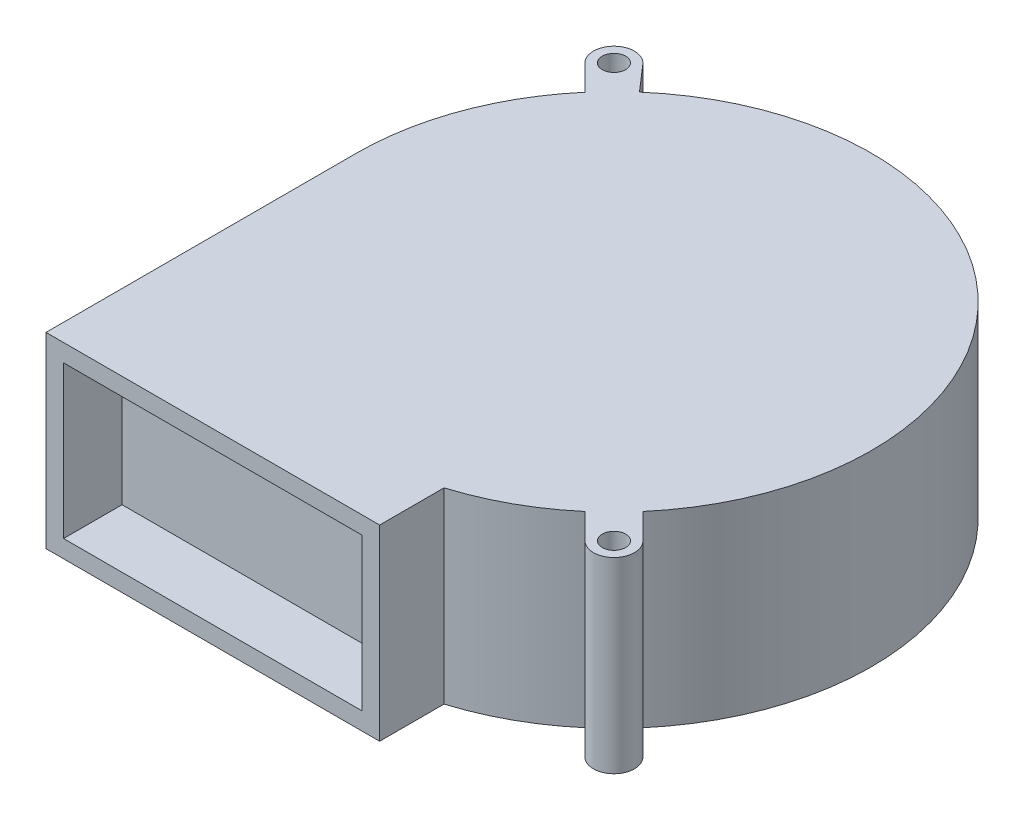
ISO-10303-21;
HEADER;
FILE_DESCRIPTION(('STEP AP214'),'2;1');
FILE_NAME('part.step','',(''),(''),'','','');
FILE_SCHEMA(('AUTOMOTIVE_DESIGN { 1 0 10303 214 1 1 1 1 }'));
ENDSEC;
DATA;
#1=APPLICATION_CONTEXT('core data for automotive mechanical design processes');
#2=APPLICATION_PROTOCOL_DEFINITION('international standard','automotive_design',2000,#1);
#3=PRODUCT_CONTEXT('',#1,'mechanical');
#4=PRODUCT('Part','Part','',(#3));
#5=PRODUCT_RELATED_PRODUCT_CATEGORY('part','',(#4));
#6=PRODUCT_DEFINITION_FORMATION('','',#4);
#7=PRODUCT_DEFINITION_CONTEXT('part definition',#1,'design');
#8=PRODUCT_DEFINITION('design','',#6,#7);
#9=PRODUCT_DEFINITION_SHAPE('','',#8);
#10=(LENGTH_UNIT() NAMED_UNIT(*) SI_UNIT(.MILLI.,.METRE.));
#11=(NAMED_UNIT(*) PLANE_ANGLE_UNIT() SI_UNIT($,.RADIAN.));
#12=(NAMED_UNIT(*) SI_UNIT($,.STERADIAN.) SOLID_ANGLE_UNIT());
#13=UNCERTAINTY_MEASURE_WITH_UNIT(LENGTH_MEASURE(1.E-05),#10,'distance_accuracy_value','');
#14=(GEOMETRIC_REPRESENTATION_CONTEXT(3) GLOBAL_UNCERTAINTY_ASSIGNED_CONTEXT((#13)) GLOBAL_UNIT_ASSIGNED_CONTEXT((#10,
#11,#12)) REPRESENTATION_CONTEXT('',''));
#15=CARTESIAN_POINT('',(0.,0.,0.));
#16=DIRECTION('',(0.,0.,1.));
#17=DIRECTION('',(1.,0.,0.));
#18=AXIS2_PLACEMENT_3D('',#15,#16,#17);
#19=CARTESIAN_POINT('',(35.3553390593273,32.,35.3553390593274));
#20=DIRECTION('',(0.,1.,0.));
#21=DIRECTION('',(0.,0.,1.));
#22=AXIS2_PLACEMENT_3D('',#19,#20,#21);
#23=PLANE('',#22);
#24=CARTESIAN_POINT('',(-35.3553390593273,32.,-35.3553390593274));
#25=DIRECTION('',(0.,1.,0.));
#26=DIRECTION('',(0.,0.,1.));
#27=AXIS2_PLACEMENT_3D('',#24,#25,#26);
#28=CIRCLE('',#27,2.);
#29=CARTESIAN_POINT('',(-35.3553390593273,32.,-33.3553390593274));
#30=VERTEX_POINT('',#29);
#31=EDGE_CURVE('E176',#30,#30,#28,.T.);
#32=ORIENTED_EDGE('',*,*,#31,.F.);
#33=EDGE_LOOP('',(#32));
#34=FACE_BOUND('',#33,.T.);
#35=CARTESIAN_POINT('',(35.3553390593273,32.,35.3553390593274));
#36=DIRECTION('',(0.,1.,0.));
#37=DIRECTION('',(0.,0.,1.));
#38=AXIS2_PLACEMENT_3D('',#35,#36,#37);
#39=CIRCLE('',#38,3.50000000000002);
#40=CARTESIAN_POINT('',(32.8804653251744,32.,37.8302127934804));
#41=VERTEX_POINT('',#40);
#42=CARTESIAN_POINT('',(37.8302127934802,32.,32.8804653251745));
#43=VERTEX_POINT('',#42);
#44=EDGE_CURVE('E196',#41,#43,#39,.T.);
#45=ORIENTED_EDGE('',*,*,#44,.T.);
#46=DIRECTION('',(-0.707106781186548,0.,-0.707106781186547));
#47=VECTOR('',#46,1.);
#48=CARTESIAN_POINT('',(37.8302127934802,32.,32.8804653251745));
#49=LINE('',#48,#47);
#50=CARTESIAN_POINT('',(33.4889834263559,32.,28.5392359580501));
#51=VERTEX_POINT('',#50);
#52=EDGE_CURVE('E116',#43,#51,#49,.T.);
#53=ORIENTED_EDGE('',*,*,#52,.T.);
#54=CARTESIAN_POINT('',(0.,32.,0.));
#55=DIRECTION('',(0.,1.,0.));
#56=DIRECTION('',(0.,0.,1.));
#57=AXIS2_PLACEMENT_3D('',#54,#55,#56);
#58=CIRCLE('',#57,44.);
#59=CARTESIAN_POINT('',(-28.8584897686789,32.,-33.2142675407882));
#60=VERTEX_POINT('',#59);
#61=EDGE_CURVE('E223',#51,#60,#58,.T.);
#62=ORIENTED_EDGE('',*,*,#61,.T.);
#63=DIRECTION('',(-0.655874767469976,0.,-0.754869716836094));
#64=VECTOR('',#63,1.);
#65=CARTESIAN_POINT('',(-32.713295050401,32.,-37.6509007454724));
#66=LINE('',#65,#64);
#67=CARTESIAN_POINT('',(-32.713295050401,32.,-37.6509007454723));
#68=VERTEX_POINT('',#67);
#69=EDGE_CURVE('E242',#60,#68,#66,.T.);
#70=ORIENTED_EDGE('',*,*,#69,.T.);
#71=CARTESIAN_POINT('',(-35.3553390593273,32.,-35.3553390593274));
#72=DIRECTION('',(0.,1.,0.));
#73=DIRECTION('',(0.,0.,1.));
#74=AXIS2_PLACEMENT_3D('',#71,#72,#73);
#75=CIRCLE('',#74,3.50000000000001);
#76=CARTESIAN_POINT('',(-37.8302127934802,32.,-32.8804653251745));
#77=VERTEX_POINT('',#76);
#78=EDGE_CURVE('E239',#68,#77,#75,.T.);
#79=ORIENTED_EDGE('',*,*,#78,.T.);
#80=DIRECTION('',(0.707106781186546,0.,0.707106781186549));
#81=VECTOR('',#80,1.);
#82=CARTESIAN_POINT('',(-37.8302127934802,32.,-32.8804653251745));
#83=LINE('',#82,#81);
#84=CARTESIAN_POINT('',(-33.4889834263559,32.,-28.5392359580501));
#85=VERTEX_POINT('',#84);
#86=EDGE_CURVE('E241',#77,#85,#83,.T.);
#87=ORIENTED_EDGE('',*,*,#86,.T.);
#88=CARTESIAN_POINT('',(0.,32.,0.));
#89=DIRECTION('',(0.,1.,0.));
#90=DIRECTION('',(0.,0.,1.));
#91=AXIS2_PLACEMENT_3D('',#88,#89,#90);
#92=CIRCLE('',#91,44.);
#93=CARTESIAN_POINT('',(-44.,32.,0.));
#94=VERTEX_POINT('',#93);
#95=EDGE_CURVE('E244',#85,#94,#92,.T.);
#96=ORIENTED_EDGE('',*,*,#95,.T.);
#97=DIRECTION('',(0.,0.,1.));
#98=VECTOR('',#97,1.);
#99=CARTESIAN_POINT('',(-44.,32.,0.));
#100=LINE('',#99,#98);
#101=CARTESIAN_POINT('',(-44.,32.,53.0356991139674));
#102=VERTEX_POINT('',#101);
#103=EDGE_CURVE('E250',#94,#102,#100,.T.);
#104=ORIENTED_EDGE('',*,*,#103,.T.);
#105=DIRECTION('',(1.,0.,0.));
#106=VECTOR('',#105,1.);
#107=CARTESIAN_POINT('',(-44.,32.,53.0356991139674));
#108=LINE('',#107,#106);
#109=CARTESIAN_POINT('',(13.,32.,53.0356991139674));
#110=VERTEX_POINT('',#109);
#111=EDGE_CURVE('E151',#102,#110,#108,.T.);
#112=ORIENTED_EDGE('',*,*,#111,.T.);
#113=DIRECTION('',(0.,0.,-1.));
#114=VECTOR('',#113,1.);
#115=CARTESIAN_POINT('',(13.,32.,53.0356991139674));
#116=LINE('',#115,#114);
#117=CARTESIAN_POINT('',(13.,32.,42.0356991139674));
#118=VERTEX_POINT('',#117);
#119=EDGE_CURVE('E144',#110,#118,#116,.T.);
#120=ORIENTED_EDGE('',*,*,#119,.T.);
#121=CARTESIAN_POINT('',(0.,32.,0.));
#122=DIRECTION('',(0.,1.,0.));
#123=DIRECTION('',(0.,0.,1.));
#124=AXIS2_PLACEMENT_3D('',#121,#122,#123);
#125=CIRCLE('',#124,44.);
#126=CARTESIAN_POINT('',(28.53923595805,32.,33.488983426356));
#127=VERTEX_POINT('',#126);
#128=EDGE_CURVE('E148',#118,#127,#125,.T.);
#129=ORIENTED_EDGE('',*,*,#128,.T.);
#130=DIRECTION('',(0.707106781186546,0.,0.707106781186549));
#131=VECTOR('',#130,1.);
#132=CARTESIAN_POINT('',(32.8804653251744,32.,37.8302127934804));
#133=LINE('',#132,#131);
#134=EDGE_CURVE('E63',#127,#41,#133,.T.);
#135=ORIENTED_EDGE('',*,*,#134,.T.);
#136=EDGE_LOOP('',(#45,#53,#62,#70,#79,#87,#96,#104,#112,#120,#129,#135));
#137=FACE_BOUND('',#136,.T.);
#138=CARTESIAN_POINT('',(35.3553390593273,32.,35.3553390593274));
#139=DIRECTION('',(0.,1.,0.));
#140=DIRECTION('',(0.,0.,1.));
#141=AXIS2_PLACEMENT_3D('',#138,#139,#140);
#142=CIRCLE('',#141,2.);
#143=CARTESIAN_POINT('',(35.3553390593273,32.,37.3553390593274));
#144=VERTEX_POINT('',#143);
#145=EDGE_CURVE('E271',#144,#144,#142,.T.);
#146=ORIENTED_EDGE('',*,*,#145,.F.);
#147=EDGE_LOOP('',(#146));
#148=FACE_BOUND('',#147,.T.);
#149=ADVANCED_FACE('F39',(#34,#137,#148),#23,.T.);
#150=CARTESIAN_POINT('',(35.3553390593273,0.,35.3553390593274));
#151=DIRECTION('',(0.,1.,0.));
#152=DIRECTION('',(0.,0.,1.));
#153=AXIS2_PLACEMENT_3D('',#150,#151,#152);
#154=PLANE('',#153);
#155=CARTESIAN_POINT('',(35.3553390593273,0.,35.3553390593274));
#156=DIRECTION('',(0.,1.,0.));
#157=DIRECTION('',(0.,0.,1.));
#158=AXIS2_PLACEMENT_3D('',#155,#156,#157);
#159=CIRCLE('',#158,3.50000000000002);
#160=CARTESIAN_POINT('',(32.8804653251744,0.,37.8302127934804));
#161=VERTEX_POINT('',#160);
#162=CARTESIAN_POINT('',(37.8302127934802,0.,32.8804653251745));
#163=VERTEX_POINT('',#162);
#164=EDGE_CURVE('E172',#161,#163,#159,.T.);
#165=ORIENTED_EDGE('',*,*,#164,.F.);
#166=DIRECTION('',(0.707106781186546,0.,0.707106781186549));
#167=VECTOR('',#166,1.);
#168=CARTESIAN_POINT('',(32.8804653251744,0.,37.8302127934804));
#169=LINE('',#168,#167);
#170=CARTESIAN_POINT('',(28.53923595805,0.,33.488983426356));
#171=VERTEX_POINT('',#170);
#172=EDGE_CURVE('E108',#171,#161,#169,.T.);
#173=ORIENTED_EDGE('',*,*,#172,.F.);
#174=CARTESIAN_POINT('',(0.,0.,0.));
#175=DIRECTION('',(0.,1.,0.));
#176=DIRECTION('',(0.,0.,1.));
#177=AXIS2_PLACEMENT_3D('',#174,#175,#176);
#178=CIRCLE('',#177,44.);
#179=CARTESIAN_POINT('',(13.,0.,42.0356991139674));
#180=VERTEX_POINT('',#179);
#181=EDGE_CURVE('E193',#180,#171,#178,.T.);
#182=ORIENTED_EDGE('',*,*,#181,.F.);
#183=DIRECTION('',(0.,0.,-1.));
#184=VECTOR('',#183,1.);
#185=CARTESIAN_POINT('',(13.,0.,53.0356991139674));
#186=LINE('',#185,#184);
#187=CARTESIAN_POINT('',(13.,0.,53.0356991139674));
#188=VERTEX_POINT('',#187);
#189=EDGE_CURVE('E160',#188,#180,#186,.T.);
#190=ORIENTED_EDGE('',*,*,#189,.F.);
#191=DIRECTION('',(1.,0.,0.));
#192=VECTOR('',#191,1.);
#193=CARTESIAN_POINT('',(-44.,0.,53.0356991139674));
#194=LINE('',#193,#192);
#195=CARTESIAN_POINT('',(-44.,0.,53.0356991139674));
#196=VERTEX_POINT('',#195);
#197=EDGE_CURVE('E190',#196,#188,#194,.T.);
#198=ORIENTED_EDGE('',*,*,#197,.F.);
#199=DIRECTION('',(0.,0.,1.));
#200=VECTOR('',#199,1.);
#201=CARTESIAN_POINT('',(-44.,0.,0.));
#202=LINE('',#201,#200);
#203=CARTESIAN_POINT('',(-44.,0.,0.));
#204=VERTEX_POINT('',#203);
#205=EDGE_CURVE('E188',#204,#196,#202,.T.);
#206=ORIENTED_EDGE('',*,*,#205,.F.);
#207=CARTESIAN_POINT('',(0.,0.,0.));
#208=DIRECTION('',(0.,1.,0.));
#209=DIRECTION('',(0.,0.,1.));
#210=AXIS2_PLACEMENT_3D('',#207,#208,#209);
#211=CIRCLE('',#210,44.);
#212=CARTESIAN_POINT('',(-33.4889834263559,0.,-28.5392359580501));
#213=VERTEX_POINT('',#212);
#214=EDGE_CURVE('E186',#213,#204,#211,.T.);
#215=ORIENTED_EDGE('',*,*,#214,.F.);
#216=DIRECTION('',(0.707106781186546,0.,0.707106781186549));
#217=VECTOR('',#216,1.);
#218=CARTESIAN_POINT('',(-37.8302127934802,0.,-32.8804653251745));
#219=LINE('',#218,#217);
#220=CARTESIAN_POINT('',(-37.8302127934802,0.,-32.8804653251745));
#221=VERTEX_POINT('',#220);
#222=EDGE_CURVE('E184',#221,#213,#219,.T.);
#223=ORIENTED_EDGE('',*,*,#222,.F.);
#224=CARTESIAN_POINT('',(-35.3553390593273,0.,-35.3553390593274));
#225=DIRECTION('',(0.,1.,0.));
#226=DIRECTION('',(0.,0.,1.));
#227=AXIS2_PLACEMENT_3D('',#224,#225,#226);
#228=CIRCLE('',#227,3.50000000000001);
#229=CARTESIAN_POINT('',(-32.713295050401,0.,-37.6509007454723));
#230=VERTEX_POINT('',#229);
#231=EDGE_CURVE('E182',#230,#221,#228,.T.);
#232=ORIENTED_EDGE('',*,*,#231,.F.);
#233=DIRECTION('',(-0.655874767469976,0.,-0.754869716836094));
#234=VECTOR('',#233,1.);
#235=CARTESIAN_POINT('',(-32.713295050401,0.,-37.6509007454724));
#236=LINE('',#235,#234);
#237=CARTESIAN_POINT('',(-28.8584897686789,0.,-33.2142675407882));
#238=VERTEX_POINT('',#237);
#239=EDGE_CURVE('E180',#238,#230,#236,.T.);
#240=ORIENTED_EDGE('',*,*,#239,.F.);
#241=CARTESIAN_POINT('',(0.,0.,0.));
#242=DIRECTION('',(0.,1.,0.));
#243=DIRECTION('',(0.,0.,1.));
#244=AXIS2_PLACEMENT_3D('',#241,#242,#243);
#245=CIRCLE('',#244,44.);
#246=CARTESIAN_POINT('',(33.4889834263559,0.,28.5392359580501));
#247=VERTEX_POINT('',#246);
#248=EDGE_CURVE('E178',#247,#238,#245,.T.);
#249=ORIENTED_EDGE('',*,*,#248,.F.);
#250=DIRECTION('',(-0.707106781186548,0.,-0.707106781186547));
#251=VECTOR('',#250,1.);
#252=CARTESIAN_POINT('',(37.8302127934802,0.,32.8804653251745));
#253=LINE('',#252,#251);
#254=EDGE_CURVE('E175',#163,#247,#253,.T.);
#255=ORIENTED_EDGE('',*,*,#254,.F.);
#256=EDGE_LOOP('',(#165,#173,#182,#190,#198,#206,#215,#223,#232,#240,#249,#255));
#257=FACE_BOUND('',#256,.T.);
#258=CARTESIAN_POINT('',(-35.3553390593273,0.,-35.3553390593274));
#259=DIRECTION('',(0.,1.,0.));
#260=DIRECTION('',(0.,0.,1.));
#261=AXIS2_PLACEMENT_3D('',#258,#259,#260);
#262=CIRCLE('',#261,2.);
#263=CARTESIAN_POINT('',(-35.3553390593273,0.,-33.3553390593274));
#264=VERTEX_POINT('',#263);
#265=EDGE_CURVE('E268',#264,#264,#262,.T.);
#266=ORIENTED_EDGE('',*,*,#265,.T.);
#267=EDGE_LOOP('',(#266));
#268=FACE_BOUND('',#267,.T.);
#269=CARTESIAN_POINT('',(35.3553390593273,0.,35.3553390593274));
#270=DIRECTION('',(0.,1.,0.));
#271=DIRECTION('',(0.,0.,1.));
#272=AXIS2_PLACEMENT_3D('',#269,#270,#271);
#273=CIRCLE('',#272,2.);
#274=CARTESIAN_POINT('',(35.3553390593273,0.,37.3553390593274));
#275=VERTEX_POINT('',#274);
#276=EDGE_CURVE('E274',#275,#275,#273,.T.);
#277=ORIENTED_EDGE('',*,*,#276,.T.);
#278=EDGE_LOOP('',(#277));
#279=FACE_BOUND('',#278,.T.);
#280=ADVANCED_FACE('F227',(#257,#268,#279),#154,.F.);
#281=CARTESIAN_POINT('',(35.3553390593273,32.,35.3553390593274));
#282=DIRECTION('',(0.,-1.,0.));
#283=DIRECTION('',(0.,0.,-1.));
#284=AXIS2_PLACEMENT_3D('',#281,#282,#283);
#285=CYLINDRICAL_SURFACE('',#284,3.50000000000002);
#286=ORIENTED_EDGE('',*,*,#164,.T.);
#287=DIRECTION('',(0.,-1.,0.));
#288=VECTOR('',#287,1.);
#289=CARTESIAN_POINT('',(37.8302127934802,32.,32.8804653251745));
#290=LINE('',#289,#288);
#291=EDGE_CURVE('E11',#43,#163,#290,.T.);
#292=ORIENTED_EDGE('',*,*,#291,.F.);
#293=ORIENTED_EDGE('',*,*,#44,.F.);
#294=DIRECTION('',(0.,-1.,0.));
#295=VECTOR('',#294,1.);
#296=CARTESIAN_POINT('',(32.8804653251744,32.,37.8302127934804));
#297=LINE('',#296,#295);
#298=EDGE_CURVE('E168',#41,#161,#297,.T.);
#299=ORIENTED_EDGE('',*,*,#298,.T.);
#300=EDGE_LOOP('',(#286,#292,#293,#299));
#301=FACE_BOUND('',#300,.T.);
#302=ADVANCED_FACE('F41',(#301),#285,.T.);
#303=CARTESIAN_POINT('',(37.8302127934802,32.,32.8804653251745));
#304=DIRECTION('',(-0.707106781186547,0.,0.707106781186548));
#305=DIRECTION('',(0.707106781186548,0.,0.707106781186547));
#306=AXIS2_PLACEMENT_3D('',#303,#304,#305);
#307=PLANE('',#306);
#308=ORIENTED_EDGE('',*,*,#254,.T.);
#309=DIRECTION('',(0.,-1.,0.));
#310=VECTOR('',#309,1.);
#311=CARTESIAN_POINT('',(33.4889834263559,32.,28.5392359580501));
#312=LINE('',#311,#310);
#313=EDGE_CURVE('E47',#51,#247,#312,.T.);
#314=ORIENTED_EDGE('',*,*,#313,.F.);
#315=ORIENTED_EDGE('',*,*,#52,.F.);
#316=ORIENTED_EDGE('',*,*,#291,.T.);
#317=EDGE_LOOP('',(#308,#314,#315,#316));
#318=FACE_BOUND('',#317,.T.);
#319=ADVANCED_FACE('F384',(#318),#307,.F.);
#320=CARTESIAN_POINT('',(0.,32.,0.));
#321=DIRECTION('',(0.,-1.,0.));
#322=DIRECTION('',(0.,0.,-1.));
#323=AXIS2_PLACEMENT_3D('',#320,#321,#322);
#324=CYLINDRICAL_SURFACE('',#323,44.);
#325=ORIENTED_EDGE('',*,*,#248,.T.);
#326=DIRECTION('',(0.,-1.,0.));
#327=VECTOR('',#326,1.);
#328=CARTESIAN_POINT('',(-28.8584897686789,32.,-33.2142675407882));
#329=LINE('',#328,#327);
#330=EDGE_CURVE('E215',#60,#238,#329,.T.);
#331=ORIENTED_EDGE('',*,*,#330,.F.);
#332=ORIENTED_EDGE('',*,*,#61,.F.);
#333=ORIENTED_EDGE('',*,*,#313,.T.);
#334=EDGE_LOOP('',(#325,#331,#332,#333));
#335=FACE_BOUND('',#334,.T.);
#336=ADVANCED_FACE('F221',(#335),#324,.T.);
#337=CARTESIAN_POINT('',(-32.713295050401,32.,-37.6509007454724));
#338=DIRECTION('',(-0.754869716836094,0.,0.655874767469976));
#339=DIRECTION('',(0.655874767469976,0.,0.754869716836095));
#340=AXIS2_PLACEMENT_3D('',#337,#338,#339);
#341=PLANE('',#340);
#342=ORIENTED_EDGE('',*,*,#239,.T.);
#343=DIRECTION('',(0.,-1.,0.));
#344=VECTOR('',#343,1.);
#345=CARTESIAN_POINT('',(-32.713295050401,32.,-37.6509007454723));
#346=LINE('',#345,#344);
#347=EDGE_CURVE('E212',#68,#230,#346,.T.);
#348=ORIENTED_EDGE('',*,*,#347,.F.);
#349=ORIENTED_EDGE('',*,*,#69,.F.);
#350=ORIENTED_EDGE('',*,*,#330,.T.);
#351=EDGE_LOOP('',(#342,#348,#349,#350));
#352=FACE_BOUND('',#351,.T.);
#353=ADVANCED_FACE('F233',(#352),#341,.F.);
#354=CARTESIAN_POINT('',(-35.3553390593273,32.,-35.3553390593274));
#355=DIRECTION('',(0.,-1.,0.));
#356=DIRECTION('',(0.,0.,-1.));
#357=AXIS2_PLACEMENT_3D('',#354,#355,#356);
#358=CYLINDRICAL_SURFACE('',#357,3.50000000000001);
#359=ORIENTED_EDGE('',*,*,#231,.T.);
#360=DIRECTION('',(0.,-1.,0.));
#361=VECTOR('',#360,1.);
#362=CARTESIAN_POINT('',(-37.8302127934802,32.,-32.8804653251745));
#363=LINE('',#362,#361);
#364=EDGE_CURVE('E209',#77,#221,#363,.T.);
#365=ORIENTED_EDGE('',*,*,#364,.F.);
#366=ORIENTED_EDGE('',*,*,#78,.F.);
#367=ORIENTED_EDGE('',*,*,#347,.T.);
#368=EDGE_LOOP('',(#359,#365,#366,#367));
#369=FACE_BOUND('',#368,.T.);
#370=ADVANCED_FACE('F237',(#369),#358,.T.);
#371=CARTESIAN_POINT('',(-37.8302127934802,32.,-32.8804653251745));
#372=DIRECTION('',(0.707106781186549,0.,-0.707106781186546));
#373=DIRECTION('',(-0.707106781186546,0.,-0.707106781186549));
#374=AXIS2_PLACEMENT_3D('',#371,#372,#373);
#375=PLANE('',#374);
#376=ORIENTED_EDGE('',*,*,#222,.T.);
#377=DIRECTION('',(0.,-1.,0.));
#378=VECTOR('',#377,1.);
#379=CARTESIAN_POINT('',(-33.4889834263559,32.,-28.5392359580501));
#380=LINE('',#379,#378);
#381=EDGE_CURVE('E206',#85,#213,#380,.T.);
#382=ORIENTED_EDGE('',*,*,#381,.F.);
#383=ORIENTED_EDGE('',*,*,#86,.F.);
#384=ORIENTED_EDGE('',*,*,#364,.T.);
#385=EDGE_LOOP('',(#376,#382,#383,#384));
#386=FACE_BOUND('',#385,.T.);
#387=ADVANCED_FACE('F374',(#386),#375,.F.);
#388=CARTESIAN_POINT('',(0.,32.,0.));
#389=DIRECTION('',(0.,-1.,0.));
#390=DIRECTION('',(0.,0.,-1.));
#391=AXIS2_PLACEMENT_3D('',#388,#389,#390);
#392=CYLINDRICAL_SURFACE('',#391,44.);
#393=ORIENTED_EDGE('',*,*,#214,.T.);
#394=DIRECTION('',(0.,-1.,0.));
#395=VECTOR('',#394,1.);
#396=CARTESIAN_POINT('',(-44.,32.,0.));
#397=LINE('',#396,#395);
#398=EDGE_CURVE('E203',#94,#204,#397,.T.);
#399=ORIENTED_EDGE('',*,*,#398,.F.);
#400=ORIENTED_EDGE('',*,*,#95,.F.);
#401=ORIENTED_EDGE('',*,*,#381,.T.);
#402=EDGE_LOOP('',(#393,#399,#400,#401));
#403=FACE_BOUND('',#402,.T.);
#404=ADVANCED_FACE('F371',(#403),#392,.T.);
#405=CARTESIAN_POINT('',(-44.,32.,0.));
#406=DIRECTION('',(1.,0.,0.));
#407=DIRECTION('',(0.,0.,-1.));
#408=AXIS2_PLACEMENT_3D('',#405,#406,#407);
#409=PLANE('',#408);
#410=ORIENTED_EDGE('',*,*,#205,.T.);
#411=DIRECTION('',(0.,-1.,0.));
#412=VECTOR('',#411,1.);
#413=CARTESIAN_POINT('',(-44.,32.,53.0356991139674));
#414=LINE('',#413,#412);
#415=EDGE_CURVE('E200',#102,#196,#414,.T.);
#416=ORIENTED_EDGE('',*,*,#415,.F.);
#417=ORIENTED_EDGE('',*,*,#103,.F.);
#418=ORIENTED_EDGE('',*,*,#398,.T.);
#419=EDGE_LOOP('',(#410,#416,#417,#418));
#420=FACE_BOUND('',#419,.T.);
#421=ADVANCED_FACE('F256',(#420),#409,.F.);
#422=CARTESIAN_POINT('',(-44.,32.,53.0356991139674));
#423=DIRECTION('',(0.,0.,-1.));
#424=DIRECTION('',(-1.,0.,0.));
#425=AXIS2_PLACEMENT_3D('',#422,#423,#424);
#426=PLANE('',#425);
#427=DIRECTION('',(1.,0.,0.));
#428=VECTOR('',#427,1.);
#429=CARTESIAN_POINT('',(-41.,3.,53.0356991139674));
#430=LINE('',#429,#428);
#431=CARTESIAN_POINT('',(-41.,3.,53.0356991139674));
#432=VERTEX_POINT('',#431);
#433=CARTESIAN_POINT('',(10.,3.,53.0356991139674));
#434=VERTEX_POINT('',#433);
#435=EDGE_CURVE('E297',#432,#434,#430,.T.);
#436=ORIENTED_EDGE('',*,*,#435,.F.);
#437=DIRECTION('',(0.,-1.,0.));
#438=VECTOR('',#437,1.);
#439=CARTESIAN_POINT('',(-41.,29.,53.0356991139674));
#440=LINE('',#439,#438);
#441=CARTESIAN_POINT('',(-41.,29.,53.0356991139674));
#442=VERTEX_POINT('',#441);
#443=EDGE_CURVE('E54',#442,#432,#440,.T.);
#444=ORIENTED_EDGE('',*,*,#443,.F.);
#445=DIRECTION('',(-1.,0.,0.));
#446=VECTOR('',#445,1.);
#447=CARTESIAN_POINT('',(-41.,29.,53.0356991139674));
#448=LINE('',#447,#446);
#449=CARTESIAN_POINT('',(10.,29.,53.0356991139674));
#450=VERTEX_POINT('',#449);
#451=EDGE_CURVE('E290',#450,#442,#448,.T.);
#452=ORIENTED_EDGE('',*,*,#451,.F.);
#453=DIRECTION('',(0.,1.,0.));
#454=VECTOR('',#453,1.);
#455=CARTESIAN_POINT('',(10.,29.,53.0356991139674));
#456=LINE('',#455,#454);
#457=EDGE_CURVE('E294',#434,#450,#456,.T.);
#458=ORIENTED_EDGE('',*,*,#457,.F.);
#459=EDGE_LOOP('',(#436,#444,#452,#458));
#460=FACE_BOUND('',#459,.T.);
#461=ORIENTED_EDGE('',*,*,#197,.T.);
#462=DIRECTION('',(0.,-1.,0.));
#463=VECTOR('',#462,1.);
#464=CARTESIAN_POINT('',(13.,32.,53.0356991139674));
#465=LINE('',#464,#463);
#466=EDGE_CURVE('E163',#110,#188,#465,.T.);
#467=ORIENTED_EDGE('',*,*,#466,.F.);
#468=ORIENTED_EDGE('',*,*,#111,.F.);
#469=ORIENTED_EDGE('',*,*,#415,.T.);
#470=EDGE_LOOP('',(#461,#467,#468,#469));
#471=FACE_BOUND('',#470,.T.);
#472=ADVANCED_FACE('F260',(#460,#471),#426,.F.);
#473=CARTESIAN_POINT('',(13.,32.,53.0356991139674));
#474=DIRECTION('',(-1.,0.,0.));
#475=DIRECTION('',(0.,0.,1.));
#476=AXIS2_PLACEMENT_3D('',#473,#474,#475);
#477=PLANE('',#476);
#478=ORIENTED_EDGE('',*,*,#189,.T.);
#479=DIRECTION('',(0.,-1.,0.));
#480=VECTOR('',#479,1.);
#481=CARTESIAN_POINT('',(13.,32.,42.0356991139674));
#482=LINE('',#481,#480);
#483=EDGE_CURVE('E157',#118,#180,#482,.T.);
#484=ORIENTED_EDGE('',*,*,#483,.F.);
#485=ORIENTED_EDGE('',*,*,#119,.F.);
#486=ORIENTED_EDGE('',*,*,#466,.T.);
#487=EDGE_LOOP('',(#478,#484,#485,#486));
#488=FACE_BOUND('',#487,.T.);
#489=ADVANCED_FACE('F158',(#488),#477,.F.);
#490=CARTESIAN_POINT('',(0.,32.,0.));
#491=DIRECTION('',(0.,-1.,0.));
#492=DIRECTION('',(0.,0.,-1.));
#493=AXIS2_PLACEMENT_3D('',#490,#491,#492);
#494=CYLINDRICAL_SURFACE('',#493,44.);
#495=ORIENTED_EDGE('',*,*,#181,.T.);
#496=DIRECTION('',(0.,-1.,0.));
#497=VECTOR('',#496,1.);
#498=CARTESIAN_POINT('',(28.53923595805,32.,33.488983426356));
#499=LINE('',#498,#497);
#500=EDGE_CURVE('E164',#127,#171,#499,.T.);
#501=ORIENTED_EDGE('',*,*,#500,.F.);
#502=ORIENTED_EDGE('',*,*,#128,.F.);
#503=ORIENTED_EDGE('',*,*,#483,.T.);
#504=EDGE_LOOP('',(#495,#501,#502,#503));
#505=FACE_BOUND('',#504,.T.);
#506=ADVANCED_FACE('F166',(#505),#494,.T.);
#507=CARTESIAN_POINT('',(32.8804653251744,32.,37.8302127934804));
#508=DIRECTION('',(0.707106781186549,0.,-0.707106781186546));
#509=DIRECTION('',(-0.707106781186546,0.,-0.707106781186549));
#510=AXIS2_PLACEMENT_3D('',#507,#508,#509);
#511=PLANE('',#510);
#512=ORIENTED_EDGE('',*,*,#172,.T.);
#513=ORIENTED_EDGE('',*,*,#298,.F.);
#514=ORIENTED_EDGE('',*,*,#134,.F.);
#515=ORIENTED_EDGE('',*,*,#500,.T.);
#516=EDGE_LOOP('',(#512,#513,#514,#515));
#517=FACE_BOUND('',#516,.T.);
#518=ADVANCED_FACE('F261',(#517),#511,.F.);
#519=CARTESIAN_POINT('',(-35.3553390593273,32.,-35.3553390593274));
#520=DIRECTION('',(0.,-1.,0.));
#521=DIRECTION('',(0.,0.,-1.));
#522=AXIS2_PLACEMENT_3D('',#519,#520,#521);
#523=CYLINDRICAL_SURFACE('',#522,2.);
#524=ORIENTED_EDGE('',*,*,#31,.T.);
#525=EDGE_LOOP('',(#524));
#526=FACE_BOUND('',#525,.T.);
#527=ORIENTED_EDGE('',*,*,#265,.F.);
#528=EDGE_LOOP('',(#527));
#529=FACE_BOUND('',#528,.T.);
#530=ADVANCED_FACE('F358',(#526,#529),#523,.F.);
#531=CARTESIAN_POINT('',(35.3553390593273,32.,35.3553390593274));
#532=DIRECTION('',(0.,-1.,0.));
#533=DIRECTION('',(0.,0.,-1.));
#534=AXIS2_PLACEMENT_3D('',#531,#532,#533);
#535=CYLINDRICAL_SURFACE('',#534,2.);
#536=ORIENTED_EDGE('',*,*,#145,.T.);
#537=EDGE_LOOP('',(#536));
#538=FACE_BOUND('',#537,.T.);
#539=ORIENTED_EDGE('',*,*,#276,.F.);
#540=EDGE_LOOP('',(#539));
#541=FACE_BOUND('',#540,.T.);
#542=ADVANCED_FACE('F464',(#538,#541),#535,.F.);
#543=CARTESIAN_POINT('',(-41.,29.,43.0356991139674));
#544=DIRECTION('',(-1.,0.,0.));
#545=DIRECTION('',(0.,0.,1.));
#546=AXIS2_PLACEMENT_3D('',#543,#544,#545);
#547=PLANE('',#546);
#548=ORIENTED_EDGE('',*,*,#443,.T.);
#549=DIRECTION('',(0.,0.,1.));
#550=VECTOR('',#549,1.);
#551=CARTESIAN_POINT('',(-41.,3.,43.0356991139674));
#552=LINE('',#551,#550);
#553=CARTESIAN_POINT('',(-41.,3.,43.0356991139674));
#554=VERTEX_POINT('',#553);
#555=EDGE_CURVE('E280',#554,#432,#552,.T.);
#556=ORIENTED_EDGE('',*,*,#555,.F.);
#557=DIRECTION('',(0.,-1.,0.));
#558=VECTOR('',#557,1.);
#559=CARTESIAN_POINT('',(-41.,29.,43.0356991139674));
#560=LINE('',#559,#558);
#561=CARTESIAN_POINT('',(-41.,29.,43.0356991139674));
#562=VERTEX_POINT('',#561);
#563=EDGE_CURVE('E293',#562,#554,#560,.T.);
#564=ORIENTED_EDGE('',*,*,#563,.F.);
#565=DIRECTION('',(0.,0.,1.));
#566=VECTOR('',#565,1.);
#567=CARTESIAN_POINT('',(-41.,29.,43.0356991139674));
#568=LINE('',#567,#566);
#569=EDGE_CURVE('E277',#562,#442,#568,.T.);
#570=ORIENTED_EDGE('',*,*,#569,.T.);
#571=EDGE_LOOP('',(#548,#556,#564,#570));
#572=FACE_BOUND('',#571,.T.);
#573=ADVANCED_FACE('F318',(#572),#547,.F.);
#574=CARTESIAN_POINT('',(-41.,29.,43.0356991139674));
#575=DIRECTION('',(0.,1.,0.));
#576=DIRECTION('',(0.,0.,1.));
#577=AXIS2_PLACEMENT_3D('',#574,#575,#576);
#578=PLANE('',#577);
#579=ORIENTED_EDGE('',*,*,#451,.T.);
#580=ORIENTED_EDGE('',*,*,#569,.F.);
#581=DIRECTION('',(-1.,0.,0.));
#582=VECTOR('',#581,1.);
#583=CARTESIAN_POINT('',(-41.,29.,43.0356991139674));
#584=LINE('',#583,#582);
#585=CARTESIAN_POINT('',(10.,29.,43.0356991139674));
#586=VERTEX_POINT('',#585);
#587=EDGE_CURVE('E283',#586,#562,#584,.T.);
#588=ORIENTED_EDGE('',*,*,#587,.F.);
#589=DIRECTION('',(0.,0.,1.));
#590=VECTOR('',#589,1.);
#591=CARTESIAN_POINT('',(10.,29.,43.0356991139674));
#592=LINE('',#591,#590);
#593=EDGE_CURVE('E286',#586,#450,#592,.T.);
#594=ORIENTED_EDGE('',*,*,#593,.T.);
#595=EDGE_LOOP('',(#579,#580,#588,#594));
#596=FACE_BOUND('',#595,.T.);
#597=ADVANCED_FACE('F329',(#596),#578,.F.);
#598=CARTESIAN_POINT('',(10.,29.,43.0356991139674));
#599=DIRECTION('',(1.,0.,0.));
#600=DIRECTION('',(0.,0.,-1.));
#601=AXIS2_PLACEMENT_3D('',#598,#599,#600);
#602=PLANE('',#601);
#603=ORIENTED_EDGE('',*,*,#457,.T.);
#604=ORIENTED_EDGE('',*,*,#593,.F.);
#605=DIRECTION('',(0.,1.,0.));
#606=VECTOR('',#605,1.);
#607=CARTESIAN_POINT('',(10.,29.,43.0356991139674));
#608=LINE('',#607,#606);
#609=CARTESIAN_POINT('',(10.,3.,43.0356991139674));
#610=VERTEX_POINT('',#609);
#611=EDGE_CURVE('E303',#610,#586,#608,.T.);
#612=ORIENTED_EDGE('',*,*,#611,.F.);
#613=DIRECTION('',(0.,0.,1.));
#614=VECTOR('',#613,1.);
#615=CARTESIAN_POINT('',(10.,3.,43.0356991139674));
#616=LINE('',#615,#614);
#617=EDGE_CURVE('E282',#610,#434,#616,.T.);
#618=ORIENTED_EDGE('',*,*,#617,.T.);
#619=EDGE_LOOP('',(#603,#604,#612,#618));
#620=FACE_BOUND('',#619,.T.);
#621=ADVANCED_FACE('F334',(#620),#602,.F.);
#622=CARTESIAN_POINT('',(-41.,3.,43.0356991139674));
#623=DIRECTION('',(0.,-1.,0.));
#624=DIRECTION('',(0.,0.,-1.));
#625=AXIS2_PLACEMENT_3D('',#622,#623,#624);
#626=PLANE('',#625);
#627=ORIENTED_EDGE('',*,*,#435,.T.);
#628=ORIENTED_EDGE('',*,*,#617,.F.);
#629=DIRECTION('',(1.,0.,0.));
#630=VECTOR('',#629,1.);
#631=CARTESIAN_POINT('',(-41.,3.,43.0356991139674));
#632=LINE('',#631,#630);
#633=EDGE_CURVE('E306',#554,#610,#632,.T.);
#634=ORIENTED_EDGE('',*,*,#633,.F.);
#635=ORIENTED_EDGE('',*,*,#555,.T.);
#636=EDGE_LOOP('',(#627,#628,#634,#635));
#637=FACE_BOUND('',#636,.T.);
#638=ADVANCED_FACE('F339',(#637),#626,.F.);
#639=CARTESIAN_POINT('',(0.,0.,43.0356991139674));
#640=DIRECTION('',(0.,0.,1.));
#641=DIRECTION('',(1.,0.,0.));
#642=AXIS2_PLACEMENT_3D('',#639,#640,#641);
#643=PLANE('',#642);
#644=ORIENTED_EDGE('',*,*,#563,.T.);
#645=ORIENTED_EDGE('',*,*,#633,.T.);
#646=ORIENTED_EDGE('',*,*,#611,.T.);
#647=ORIENTED_EDGE('',*,*,#587,.T.);
#648=EDGE_LOOP('',(#644,#645,#646,#647));
#649=FACE_BOUND('',#648,.T.);
#650=ADVANCED_FACE('F313',(#649),#643,.T.);
#651=CLOSED_SHELL('',(#149,#280,#302,#319,#336,#353,#370,#387,#404,#421,#472,#489,#506,#518,
#530,#542,#573,#597,#621,#638,#650));
#652=MANIFOLD_SOLID_BREP('B2',#651);
#653=ADVANCED_BREP_SHAPE_REPRESENTATION('',(#18,#652),#14);
#654=SHAPE_DEFINITION_REPRESENTATION(#9,#653);
ENDSEC;
END-ISO-10303-21;
